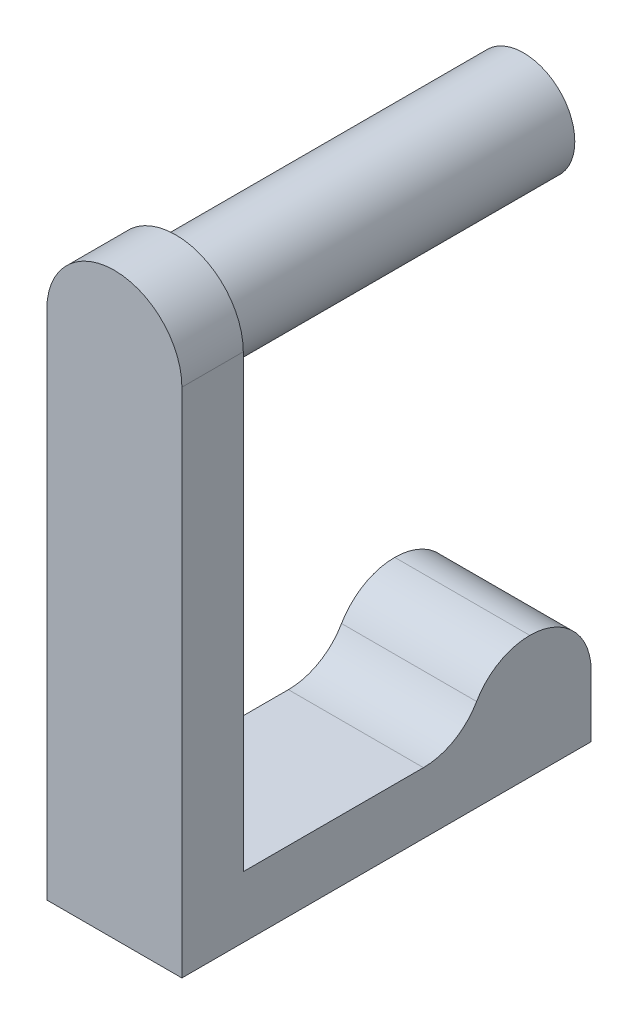
ISO-10303-21;
HEADER;
FILE_DESCRIPTION(('STEP AP214'),'2;1');
FILE_NAME('part.step','',(''),(''),'','','');
FILE_SCHEMA(('AUTOMOTIVE_DESIGN { 1 0 10303 214 1 1 1 1 }'));
ENDSEC;
DATA;
#1=APPLICATION_CONTEXT('core data for automotive mechanical design processes');
#2=APPLICATION_PROTOCOL_DEFINITION('international standard','automotive_design',2000,#1);
#3=PRODUCT_CONTEXT('',#1,'mechanical');
#4=PRODUCT('Part','Part','',(#3));
#5=PRODUCT_RELATED_PRODUCT_CATEGORY('part','',(#4));
#6=PRODUCT_DEFINITION_FORMATION('','',#4);
#7=PRODUCT_DEFINITION_CONTEXT('part definition',#1,'design');
#8=PRODUCT_DEFINITION('design','',#6,#7);
#9=PRODUCT_DEFINITION_SHAPE('','',#8);
#10=(LENGTH_UNIT() NAMED_UNIT(*) SI_UNIT(.MILLI.,.METRE.));
#11=(NAMED_UNIT(*) PLANE_ANGLE_UNIT() SI_UNIT($,.RADIAN.));
#12=(NAMED_UNIT(*) SI_UNIT($,.STERADIAN.) SOLID_ANGLE_UNIT());
#13=UNCERTAINTY_MEASURE_WITH_UNIT(LENGTH_MEASURE(1.E-05),#10,'distance_accuracy_value','');
#14=(GEOMETRIC_REPRESENTATION_CONTEXT(3) GLOBAL_UNCERTAINTY_ASSIGNED_CONTEXT((#13)) GLOBAL_UNIT_ASSIGNED_CONTEXT((#10,
#11,#12)) REPRESENTATION_CONTEXT('',''));
#15=CARTESIAN_POINT('',(0.,0.,0.));
#16=DIRECTION('',(0.,0.,1.));
#17=DIRECTION('',(1.,0.,0.));
#18=AXIS2_PLACEMENT_3D('',#15,#16,#17);
#19=CARTESIAN_POINT('',(-2.94139734769127,-12.6562787710412,-17.));
#20=DIRECTION('',(0.,-1.,0.));
#21=DIRECTION('',(1.,0.,0.));
#22=AXIS2_PLACEMENT_3D('',#19,#20,#21);
#23=PLANE('',#22);
#24=DIRECTION('',(0.,0.,1.));
#25=VECTOR('',#24,1.);
#26=CARTESIAN_POINT('',(-2.94139734769127,-12.6562787710412,-17.));
#27=LINE('',#26,#25);
#28=CARTESIAN_POINT('',(-2.94139734769127,-12.6562787710412,-8.80384757729337));
#29=VERTEX_POINT('',#28);
#30=CARTESIAN_POINT('',(-2.94139734769127,-12.6562787710412,0.));
#31=VERTEX_POINT('',#30);
#32=EDGE_CURVE('E165',#29,#31,#27,.T.);
#33=ORIENTED_EDGE('',*,*,#32,.F.);
#34=DIRECTION('',(-1.,0.,0.));
#35=VECTOR('',#34,1.);
#36=CARTESIAN_POINT('',(-2.94139734769127,-12.6562787710412,-8.80384757729337));
#37=LINE('',#36,#35);
#38=CARTESIAN_POINT('',(-9.54139734769127,-12.6562787710412,-8.80384757729337));
#39=VERTEX_POINT('',#38);
#40=EDGE_CURVE('E223',#29,#39,#37,.T.);
#41=ORIENTED_EDGE('',*,*,#40,.T.);
#42=DIRECTION('',(0.,0.,1.));
#43=VECTOR('',#42,1.);
#44=CARTESIAN_POINT('',(-9.54139734769127,-12.6562787710412,-17.));
#45=LINE('',#44,#43);
#46=CARTESIAN_POINT('',(-9.54139734769127,-12.6562787710412,0.));
#47=VERTEX_POINT('',#46);
#48=EDGE_CURVE('E173',#39,#47,#45,.T.);
#49=ORIENTED_EDGE('',*,*,#48,.T.);
#50=DIRECTION('',(1.,0.,0.));
#51=VECTOR('',#50,1.);
#52=CARTESIAN_POINT('',(-2.94139734769127,-12.6562787710412,0.));
#53=LINE('',#52,#51);
#54=EDGE_CURVE('E145',#47,#31,#53,.T.);
#55=ORIENTED_EDGE('',*,*,#54,.T.);
#56=EDGE_LOOP('',(#33,#41,#49,#55));
#57=FACE_BOUND('',#56,.T.);
#58=ADVANCED_FACE('F68',(#57),#23,.F.);
#59=CARTESIAN_POINT('',(0.,0.,0.));
#60=DIRECTION('',(0.,0.,1.));
#61=DIRECTION('',(1.,0.,0.));
#62=AXIS2_PLACEMENT_3D('',#59,#60,#61);
#63=PLANE('',#62);
#64=ORIENTED_EDGE('',*,*,#54,.F.);
#65=DIRECTION('',(0.,-1.,0.));
#66=VECTOR('',#65,1.);
#67=CARTESIAN_POINT('',(-9.54139734769127,0.,0.));
#68=LINE('',#67,#66);
#69=CARTESIAN_POINT('',(-9.54139734769127,9.34372122895877,0.));
#70=VERTEX_POINT('',#69);
#71=EDGE_CURVE('E193',#70,#47,#68,.T.);
#72=ORIENTED_EDGE('',*,*,#71,.F.);
#73=CARTESIAN_POINT('',(-6.24139734769127,9.34372122895877,0.));
#74=DIRECTION('',(0.,0.,1.));
#75=DIRECTION('',(1.,0.,0.));
#76=AXIS2_PLACEMENT_3D('',#73,#74,#75);
#77=CIRCLE('',#76,3.3);
#78=CARTESIAN_POINT('',(-2.94139734769127,9.34372122895877,0.));
#79=VERTEX_POINT('',#78);
#80=EDGE_CURVE('E176',#79,#70,#77,.T.);
#81=ORIENTED_EDGE('',*,*,#80,.F.);
#82=DIRECTION('',(0.,-1.,0.));
#83=VECTOR('',#82,1.);
#84=CARTESIAN_POINT('',(-2.94139734769127,0.,0.));
#85=LINE('',#84,#83);
#86=EDGE_CURVE('E182',#79,#31,#85,.T.);
#87=ORIENTED_EDGE('',*,*,#86,.T.);
#88=EDGE_LOOP('',(#64,#72,#81,#87));
#89=FACE_BOUND('',#88,.T.);
#90=ADVANCED_FACE('F251',(#89),#63,.F.);
#91=CARTESIAN_POINT('',(-9.54139734769127,0.,3.));
#92=DIRECTION('',(1.,0.,0.));
#93=DIRECTION('',(0.,0.,-1.));
#94=AXIS2_PLACEMENT_3D('',#91,#92,#93);
#95=PLANE('',#94);
#96=CARTESIAN_POINT('',(-9.54139734769127,-12.6562787710412,-14.));
#97=DIRECTION('',(1.,0.,0.));
#98=DIRECTION('',(0.,0.,-1.));
#99=AXIS2_PLACEMENT_3D('',#96,#97,#98);
#100=CIRCLE('',#99,3.);
#101=CARTESIAN_POINT('',(-9.54139734769127,-11.1562787710412,-11.4019237886467));
#102=VERTEX_POINT('',#101);
#103=CARTESIAN_POINT('',(-9.54139734769127,-9.65627877104123,-14.));
#104=VERTEX_POINT('',#103);
#105=EDGE_CURVE('E216',#102,#104,#100,.F.);
#106=ORIENTED_EDGE('',*,*,#105,.T.);
#107=CARTESIAN_POINT('',(-9.54139734769127,-12.6562787710412,-14.));
#108=DIRECTION('',(1.,0.,0.));
#109=DIRECTION('',(0.,0.,-1.));
#110=AXIS2_PLACEMENT_3D('',#107,#108,#109);
#111=CIRCLE('',#110,3.);
#112=CARTESIAN_POINT('',(-9.54139734769127,-12.6562787710412,-17.));
#113=VERTEX_POINT('',#112);
#114=EDGE_CURVE('E91',#104,#113,#111,.F.);
#115=ORIENTED_EDGE('',*,*,#114,.T.);
#116=DIRECTION('',(0.,1.,0.));
#117=VECTOR('',#116,1.);
#118=CARTESIAN_POINT('',(-9.54139734769127,-12.6562787710412,-17.));
#119=LINE('',#118,#117);
#120=CARTESIAN_POINT('',(-9.54139734769127,-15.6562787710412,-17.));
#121=VERTEX_POINT('',#120);
#122=EDGE_CURVE('E162',#121,#113,#119,.T.);
#123=ORIENTED_EDGE('',*,*,#122,.F.);
#124=DIRECTION('',(0.,0.,-1.));
#125=VECTOR('',#124,1.);
#126=CARTESIAN_POINT('',(-9.54139734769127,-15.6562787710412,3.));
#127=LINE('',#126,#125);
#128=CARTESIAN_POINT('',(-9.54139734769127,-15.6562787710412,3.));
#129=VERTEX_POINT('',#128);
#130=EDGE_CURVE('E156',#129,#121,#127,.T.);
#131=ORIENTED_EDGE('',*,*,#130,.F.);
#132=DIRECTION('',(0.,-1.,0.));
#133=VECTOR('',#132,1.);
#134=CARTESIAN_POINT('',(-9.54139734769127,0.,3.));
#135=LINE('',#134,#133);
#136=CARTESIAN_POINT('',(-9.54139734769127,9.34372122895877,3.));
#137=VERTEX_POINT('',#136);
#138=EDGE_CURVE('E181',#137,#129,#135,.T.);
#139=ORIENTED_EDGE('',*,*,#138,.F.);
#140=DIRECTION('',(0.,0.,-1.));
#141=VECTOR('',#140,1.);
#142=CARTESIAN_POINT('',(-9.54139734769127,9.34372122895877,3.));
#143=LINE('',#142,#141);
#144=EDGE_CURVE('E204',#137,#70,#143,.T.);
#145=ORIENTED_EDGE('',*,*,#144,.T.);
#146=ORIENTED_EDGE('',*,*,#71,.T.);
#147=ORIENTED_EDGE('',*,*,#48,.F.);
#148=CARTESIAN_POINT('',(-9.54139734769127,-9.65627877104123,-8.80384757729337));
#149=DIRECTION('',(1.,0.,0.));
#150=DIRECTION('',(0.,0.,-1.));
#151=AXIS2_PLACEMENT_3D('',#148,#149,#150);
#152=CIRCLE('',#151,3.);
#153=EDGE_CURVE('E229',#39,#102,#152,.T.);
#154=ORIENTED_EDGE('',*,*,#153,.T.);
#155=EDGE_LOOP('',(#106,#115,#123,#131,#139,#145,#146,#147,#154));
#156=FACE_BOUND('',#155,.T.);
#157=ADVANCED_FACE('F237',(#156),#95,.F.);
#158=CARTESIAN_POINT('',(0.,-15.6562787710412,3.));
#159=DIRECTION('',(0.,1.,0.));
#160=DIRECTION('',(0.,0.,1.));
#161=AXIS2_PLACEMENT_3D('',#158,#159,#160);
#162=PLANE('',#161);
#163=ORIENTED_EDGE('',*,*,#130,.T.);
#164=DIRECTION('',(-1.,0.,0.));
#165=VECTOR('',#164,1.);
#166=CARTESIAN_POINT('',(-2.94139734769127,-15.6562787710412,-17.));
#167=LINE('',#166,#165);
#168=CARTESIAN_POINT('',(-2.94139734769127,-15.6562787710412,-17.));
#169=VERTEX_POINT('',#168);
#170=EDGE_CURVE('E141',#169,#121,#167,.T.);
#171=ORIENTED_EDGE('',*,*,#170,.F.);
#172=DIRECTION('',(0.,0.,-1.));
#173=VECTOR('',#172,1.);
#174=CARTESIAN_POINT('',(-2.94139734769127,-15.6562787710412,3.));
#175=LINE('',#174,#173);
#176=CARTESIAN_POINT('',(-2.94139734769127,-15.6562787710412,3.));
#177=VERTEX_POINT('',#176);
#178=EDGE_CURVE('E149',#177,#169,#175,.T.);
#179=ORIENTED_EDGE('',*,*,#178,.F.);
#180=DIRECTION('',(1.,0.,0.));
#181=VECTOR('',#180,1.);
#182=CARTESIAN_POINT('',(0.,-15.6562787710412,3.));
#183=LINE('',#182,#181);
#184=EDGE_CURVE('E185',#129,#177,#183,.T.);
#185=ORIENTED_EDGE('',*,*,#184,.F.);
#186=EDGE_LOOP('',(#163,#171,#179,#185));
#187=FACE_BOUND('',#186,.T.);
#188=ADVANCED_FACE('F159',(#187),#162,.F.);
#189=CARTESIAN_POINT('',(-2.94139734769127,0.,3.));
#190=DIRECTION('',(1.,0.,0.));
#191=DIRECTION('',(0.,0.,-1.));
#192=AXIS2_PLACEMENT_3D('',#189,#190,#191);
#193=PLANE('',#192);
#194=DIRECTION('',(0.,-1.,0.));
#195=VECTOR('',#194,1.);
#196=CARTESIAN_POINT('',(-2.94139734769127,-12.6562787710412,-17.));
#197=LINE('',#196,#195);
#198=CARTESIAN_POINT('',(-2.94139734769127,-12.6562787710412,-17.));
#199=VERTEX_POINT('',#198);
#200=EDGE_CURVE('E137',#199,#169,#197,.T.);
#201=ORIENTED_EDGE('',*,*,#200,.F.);
#202=CARTESIAN_POINT('',(-2.94139734769127,-12.6562787710412,-14.));
#203=DIRECTION('',(1.,0.,0.));
#204=DIRECTION('',(0.,0.,-1.));
#205=AXIS2_PLACEMENT_3D('',#202,#203,#204);
#206=CIRCLE('',#205,3.);
#207=CARTESIAN_POINT('',(-2.94139734769127,-9.65627877104123,-14.));
#208=VERTEX_POINT('',#207);
#209=EDGE_CURVE('E13',#199,#208,#206,.T.);
#210=ORIENTED_EDGE('',*,*,#209,.T.);
#211=CARTESIAN_POINT('',(-2.94139734769127,-12.6562787710412,-14.));
#212=DIRECTION('',(1.,0.,0.));
#213=DIRECTION('',(0.,0.,-1.));
#214=AXIS2_PLACEMENT_3D('',#211,#212,#213);
#215=CIRCLE('',#214,3.);
#216=CARTESIAN_POINT('',(-2.94139734769127,-11.1562787710412,-11.4019237886467));
#217=VERTEX_POINT('',#216);
#218=EDGE_CURVE('E212',#208,#217,#215,.T.);
#219=ORIENTED_EDGE('',*,*,#218,.T.);
#220=CARTESIAN_POINT('',(-2.94139734769127,-9.65627877104123,-8.80384757729337));
#221=DIRECTION('',(1.,0.,0.));
#222=DIRECTION('',(0.,0.,-1.));
#223=AXIS2_PLACEMENT_3D('',#220,#221,#222);
#224=CIRCLE('',#223,3.);
#225=EDGE_CURVE('E226',#217,#29,#224,.F.);
#226=ORIENTED_EDGE('',*,*,#225,.T.);
#227=ORIENTED_EDGE('',*,*,#32,.T.);
#228=ORIENTED_EDGE('',*,*,#86,.F.);
#229=DIRECTION('',(0.,0.,-1.));
#230=VECTOR('',#229,1.);
#231=CARTESIAN_POINT('',(-2.94139734769127,9.34372122895877,3.));
#232=LINE('',#231,#230);
#233=CARTESIAN_POINT('',(-2.94139734769127,9.34372122895877,3.));
#234=VERTEX_POINT('',#233);
#235=EDGE_CURVE('E157',#234,#79,#232,.T.);
#236=ORIENTED_EDGE('',*,*,#235,.F.);
#237=DIRECTION('',(0.,-1.,0.));
#238=VECTOR('',#237,1.);
#239=CARTESIAN_POINT('',(-2.94139734769127,0.,3.));
#240=LINE('',#239,#238);
#241=EDGE_CURVE('E152',#234,#177,#240,.T.);
#242=ORIENTED_EDGE('',*,*,#241,.T.);
#243=ORIENTED_EDGE('',*,*,#178,.T.);
#244=EDGE_LOOP('',(#201,#210,#219,#226,#227,#228,#236,#242,#243));
#245=FACE_BOUND('',#244,.T.);
#246=ADVANCED_FACE('F150',(#245),#193,.T.);
#247=CARTESIAN_POINT('',(-6.24139734769127,9.34372122895877,3.));
#248=DIRECTION('',(0.,0.,-1.));
#249=DIRECTION('',(-1.,0.,0.));
#250=AXIS2_PLACEMENT_3D('',#247,#248,#249);
#251=CYLINDRICAL_SURFACE('',#250,3.3);
#252=ORIENTED_EDGE('',*,*,#80,.T.);
#253=ORIENTED_EDGE('',*,*,#144,.F.);
#254=CARTESIAN_POINT('',(-6.24139734769127,9.34372122895877,3.));
#255=DIRECTION('',(0.,0.,1.));
#256=DIRECTION('',(1.,0.,0.));
#257=AXIS2_PLACEMENT_3D('',#254,#255,#256);
#258=CIRCLE('',#257,3.3);
#259=EDGE_CURVE('E177',#234,#137,#258,.T.);
#260=ORIENTED_EDGE('',*,*,#259,.F.);
#261=ORIENTED_EDGE('',*,*,#235,.T.);
#262=EDGE_LOOP('',(#252,#253,#260,#261));
#263=FACE_BOUND('',#262,.T.);
#264=ADVANCED_FACE('F256',(#263),#251,.T.);
#265=CARTESIAN_POINT('',(0.,0.,3.));
#266=DIRECTION('',(0.,0.,1.));
#267=DIRECTION('',(1.,0.,0.));
#268=AXIS2_PLACEMENT_3D('',#265,#266,#267);
#269=PLANE('',#268);
#270=ORIENTED_EDGE('',*,*,#259,.T.);
#271=ORIENTED_EDGE('',*,*,#138,.T.);
#272=ORIENTED_EDGE('',*,*,#184,.T.);
#273=ORIENTED_EDGE('',*,*,#241,.F.);
#274=EDGE_LOOP('',(#270,#271,#272,#273));
#275=FACE_BOUND('',#274,.T.);
#276=ADVANCED_FACE('F258',(#275),#269,.T.);
#277=CARTESIAN_POINT('',(0.,0.,-17.));
#278=DIRECTION('',(0.,0.,-1.));
#279=DIRECTION('',(-1.,0.,0.));
#280=AXIS2_PLACEMENT_3D('',#277,#278,#279);
#281=PLANE('',#280);
#282=ORIENTED_EDGE('',*,*,#122,.T.);
#283=DIRECTION('',(-1.,0.,0.));
#284=VECTOR('',#283,1.);
#285=CARTESIAN_POINT('',(0.,-12.6562787710412,-17.));
#286=LINE('',#285,#284);
#287=EDGE_CURVE('E77',#113,#199,#286,.F.);
#288=ORIENTED_EDGE('',*,*,#287,.T.);
#289=ORIENTED_EDGE('',*,*,#200,.T.);
#290=ORIENTED_EDGE('',*,*,#170,.T.);
#291=EDGE_LOOP('',(#282,#288,#289,#290));
#292=FACE_BOUND('',#291,.T.);
#293=ADVANCED_FACE('F139',(#292),#281,.T.);
#294=CARTESIAN_POINT('',(0.,-12.6562787710412,-14.));
#295=DIRECTION('',(-1.,0.,0.));
#296=DIRECTION('',(0.,0.,1.));
#297=AXIS2_PLACEMENT_3D('',#294,#295,#296);
#298=CYLINDRICAL_SURFACE('',#297,3.);
#299=ORIENTED_EDGE('',*,*,#105,.F.);
#300=DIRECTION('',(-1.,0.,0.));
#301=VECTOR('',#300,1.);
#302=CARTESIAN_POINT('',(0.,-11.1562787710412,-11.4019237886467));
#303=LINE('',#302,#301);
#304=EDGE_CURVE('E219',#102,#217,#303,.F.);
#305=ORIENTED_EDGE('',*,*,#304,.T.);
#306=ORIENTED_EDGE('',*,*,#218,.F.);
#307=DIRECTION('',(1.,0.,0.));
#308=VECTOR('',#307,1.);
#309=CARTESIAN_POINT('',(-2.94139734769127,-9.65627877104123,-14.));
#310=LINE('',#309,#308);
#311=EDGE_CURVE('E208',#104,#208,#310,.T.);
#312=ORIENTED_EDGE('',*,*,#311,.F.);
#313=EDGE_LOOP('',(#299,#305,#306,#312));
#314=FACE_BOUND('',#313,.T.);
#315=ADVANCED_FACE('F243',(#314),#298,.T.);
#316=CARTESIAN_POINT('',(0.,-9.65627877104123,-8.80384757729337));
#317=DIRECTION('',(-1.,0.,0.));
#318=DIRECTION('',(0.,0.,1.));
#319=AXIS2_PLACEMENT_3D('',#316,#317,#318);
#320=CYLINDRICAL_SURFACE('',#319,3.);
#321=ORIENTED_EDGE('',*,*,#153,.F.);
#322=ORIENTED_EDGE('',*,*,#40,.F.);
#323=ORIENTED_EDGE('',*,*,#225,.F.);
#324=ORIENTED_EDGE('',*,*,#304,.F.);
#325=EDGE_LOOP('',(#321,#322,#323,#324));
#326=FACE_BOUND('',#325,.T.);
#327=ADVANCED_FACE('F245',(#326),#320,.F.);
#328=CARTESIAN_POINT('',(0.,-12.6562787710412,-14.));
#329=DIRECTION('',(-1.,0.,0.));
#330=DIRECTION('',(0.,0.,1.));
#331=AXIS2_PLACEMENT_3D('',#328,#329,#330);
#332=CYLINDRICAL_SURFACE('',#331,3.);
#333=ORIENTED_EDGE('',*,*,#209,.F.);
#334=ORIENTED_EDGE('',*,*,#287,.F.);
#335=ORIENTED_EDGE('',*,*,#114,.F.);
#336=ORIENTED_EDGE('',*,*,#311,.T.);
#337=EDGE_LOOP('',(#333,#334,#335,#336));
#338=FACE_BOUND('',#337,.T.);
#339=ADVANCED_FACE('F70',(#338),#332,.T.);
#340=CLOSED_SHELL('',(#58,#90,#157,#188,#246,#264,#276,#293,#315,#327,#339));
#341=MANIFOLD_SOLID_BREP('B2',#340);
#342=CARTESIAN_POINT('',(-6.24139734769127,9.34372122895877,-17.));
#343=DIRECTION('',(0.,0.,1.));
#344=DIRECTION('',(1.,0.,0.));
#345=AXIS2_PLACEMENT_3D('',#342,#343,#344);
#346=CYLINDRICAL_SURFACE('',#345,2.5);
#347=CARTESIAN_POINT('',(-6.24139734769127,9.34372122895877,-17.));
#348=DIRECTION('',(0.,0.,1.));
#349=DIRECTION('',(1.,0.,0.));
#350=AXIS2_PLACEMENT_3D('',#347,#348,#349);
#351=CIRCLE('',#350,2.5);
#352=CARTESIAN_POINT('',(-3.74139734769127,9.34372122895877,-17.));
#353=VERTEX_POINT('',#352);
#354=EDGE_CURVE('E67',#353,#353,#351,.T.);
#355=ORIENTED_EDGE('',*,*,#354,.T.);
#356=EDGE_LOOP('',(#355));
#357=FACE_BOUND('',#356,.T.);
#358=CARTESIAN_POINT('',(-6.24139734769127,9.34372122895877,0.));
#359=DIRECTION('',(0.,0.,1.));
#360=DIRECTION('',(1.,0.,0.));
#361=AXIS2_PLACEMENT_3D('',#358,#359,#360);
#362=CIRCLE('',#361,2.5);
#363=CARTESIAN_POINT('',(-3.74139734769127,9.34372122895877,0.));
#364=VERTEX_POINT('',#363);
#365=EDGE_CURVE('E410',#364,#364,#362,.T.);
#366=ORIENTED_EDGE('',*,*,#365,.F.);
#367=EDGE_LOOP('',(#366));
#368=FACE_BOUND('',#367,.T.);
#369=ADVANCED_FACE('F407',(#357,#368),#346,.T.);
#370=CARTESIAN_POINT('',(-6.24139734769127,9.34372122895877,-17.));
#371=DIRECTION('',(0.,0.,1.));
#372=DIRECTION('',(1.,0.,0.));
#373=AXIS2_PLACEMENT_3D('',#370,#371,#372);
#374=PLANE('',#373);
#375=ORIENTED_EDGE('',*,*,#354,.F.);
#376=EDGE_LOOP('',(#375));
#377=FACE_BOUND('',#376,.T.);
#378=ADVANCED_FACE('F422',(#377),#374,.F.);
#379=CARTESIAN_POINT('',(-6.24139734769127,9.34372122895877,0.));
#380=DIRECTION('',(0.,0.,1.));
#381=DIRECTION('',(1.,0.,0.));
#382=AXIS2_PLACEMENT_3D('',#379,#380,#381);
#383=PLANE('',#382);
#384=ORIENTED_EDGE('',*,*,#365,.T.);
#385=EDGE_LOOP('',(#384));
#386=FACE_BOUND('',#385,.T.);
#387=ADVANCED_FACE('F419',(#386),#383,.T.);
#388=CLOSED_SHELL('',(#369,#378,#387));
#389=MANIFOLD_SOLID_BREP('B7',#388);
#390=ADVANCED_BREP_SHAPE_REPRESENTATION('',(#18,#341,#389),#14);
#391=SHAPE_DEFINITION_REPRESENTATION(#9,#390);
ENDSEC;
END-ISO-10303-21;
